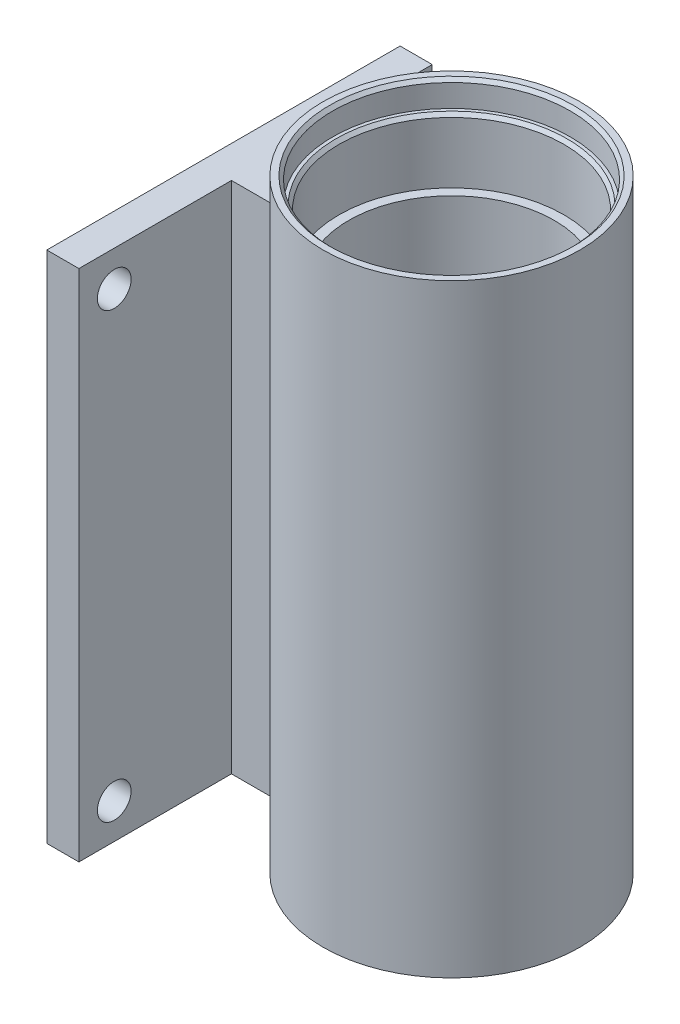
ISO-10303-21;
HEADER;
FILE_DESCRIPTION(('STEP AP214'),'2;1');
FILE_NAME('part.step','',(''),(''),'','','');
FILE_SCHEMA(('AUTOMOTIVE_DESIGN { 1 0 10303 214 1 1 1 1 }'));
ENDSEC;
DATA;
#1=APPLICATION_CONTEXT('core data for automotive mechanical design processes');
#2=APPLICATION_PROTOCOL_DEFINITION('international standard','automotive_design',2000,#1);
#3=PRODUCT_CONTEXT('',#1,'mechanical');
#4=PRODUCT('Part','Part','',(#3));
#5=PRODUCT_RELATED_PRODUCT_CATEGORY('part','',(#4));
#6=PRODUCT_DEFINITION_FORMATION('','',#4);
#7=PRODUCT_DEFINITION_CONTEXT('part definition',#1,'design');
#8=PRODUCT_DEFINITION('design','',#6,#7);
#9=PRODUCT_DEFINITION_SHAPE('','',#8);
#10=(LENGTH_UNIT() NAMED_UNIT(*) SI_UNIT(.MILLI.,.METRE.));
#11=(NAMED_UNIT(*) PLANE_ANGLE_UNIT() SI_UNIT($,.RADIAN.));
#12=(NAMED_UNIT(*) SI_UNIT($,.STERADIAN.) SOLID_ANGLE_UNIT());
#13=UNCERTAINTY_MEASURE_WITH_UNIT(LENGTH_MEASURE(1.E-05),#10,'distance_accuracy_value','');
#14=(GEOMETRIC_REPRESENTATION_CONTEXT(3) GLOBAL_UNCERTAINTY_ASSIGNED_CONTEXT((#13)) GLOBAL_UNIT_ASSIGNED_CONTEXT((#10,
#11,#12)) REPRESENTATION_CONTEXT('',''));
#15=CARTESIAN_POINT('',(0.,0.,0.));
#16=DIRECTION('',(0.,0.,1.));
#17=DIRECTION('',(1.,0.,0.));
#18=AXIS2_PLACEMENT_3D('',#15,#16,#17);
#19=CARTESIAN_POINT('',(0.,160.,0.));
#20=DIRECTION('',(0.,-1.,0.));
#21=DIRECTION('',(0.,0.,-1.));
#22=AXIS2_PLACEMENT_3D('',#19,#20,#21);
#23=CYLINDRICAL_SURFACE('',#22,32.);
#24=CARTESIAN_POINT('',(0.,160.,0.));
#25=DIRECTION('',(0.,1.,0.));
#26=DIRECTION('',(0.,0.,1.));
#27=AXIS2_PLACEMENT_3D('',#24,#25,#26);
#28=CIRCLE('',#27,32.);
#29=CARTESIAN_POINT('',(0.,160.,32.));
#30=VERTEX_POINT('',#29);
#31=EDGE_CURVE('E154',#30,#30,#28,.T.);
#32=ORIENTED_EDGE('',*,*,#31,.T.);
#33=EDGE_LOOP('',(#32));
#34=FACE_BOUND('',#33,.T.);
#35=CARTESIAN_POINT('',(0.,20.,0.));
#36=DIRECTION('',(0.,-1.,0.));
#37=DIRECTION('',(0.,0.,-1.));
#38=AXIS2_PLACEMENT_3D('',#35,#36,#37);
#39=CIRCLE('',#38,32.);
#40=CARTESIAN_POINT('',(0.,20.,-32.));
#41=VERTEX_POINT('',#40);
#42=EDGE_CURVE('E228',#41,#41,#39,.T.);
#43=ORIENTED_EDGE('',*,*,#42,.T.);
#44=EDGE_LOOP('',(#43));
#45=FACE_BOUND('',#44,.T.);
#46=ADVANCED_FACE('F45',(#34,#45),#23,.F.);
#47=CARTESIAN_POINT('',(0.,160.,0.));
#48=DIRECTION('',(0.,1.,0.));
#49=DIRECTION('',(0.,0.,1.));
#50=AXIS2_PLACEMENT_3D('',#47,#48,#49);
#51=PLANE('',#50);
#52=ORIENTED_EDGE('',*,*,#31,.F.);
#53=EDGE_LOOP('',(#52));
#54=FACE_BOUND('',#53,.T.);
#55=CARTESIAN_POINT('',(0.,160.,0.));
#56=DIRECTION('',(0.,1.,0.));
#57=DIRECTION('',(0.,0.,1.));
#58=AXIS2_PLACEMENT_3D('',#55,#56,#57);
#59=CIRCLE('',#58,35.);
#60=CARTESIAN_POINT('',(0.,160.,35.));
#61=VERTEX_POINT('',#60);
#62=EDGE_CURVE('E198',#61,#61,#59,.T.);
#63=ORIENTED_EDGE('',*,*,#62,.T.);
#64=EDGE_LOOP('',(#63));
#65=FACE_BOUND('',#64,.T.);
#66=ADVANCED_FACE('F266',(#54,#65),#51,.T.);
#67=CARTESIAN_POINT('',(0.,160.,0.));
#68=DIRECTION('',(0.,1.,0.));
#69=DIRECTION('',(0.,0.,1.));
#70=AXIS2_PLACEMENT_3D('',#67,#68,#69);
#71=CIRCLE('',#70,40.);
#72=CARTESIAN_POINT('',(-39.2905841137543,160.,-7.5));
#73=VERTEX_POINT('',#72);
#74=CARTESIAN_POINT('',(-39.2905841137543,160.,7.5));
#75=VERTEX_POINT('',#74);
#76=EDGE_CURVE('E193',#73,#75,#71,.T.);
#77=ORIENTED_EDGE('',*,*,#76,.F.);
#78=DIRECTION('',(-1.,0.,0.));
#79=VECTOR('',#78,1.);
#80=CARTESIAN_POINT('',(-39.2905841137543,160.,-7.5));
#81=LINE('',#80,#79);
#82=CARTESIAN_POINT('',(-61.,160.,-7.49999999999999));
#83=VERTEX_POINT('',#82);
#84=EDGE_CURVE('E126',#73,#83,#81,.T.);
#85=ORIENTED_EDGE('',*,*,#84,.T.);
#86=DIRECTION('',(0.,0.,-1.));
#87=VECTOR('',#86,1.);
#88=CARTESIAN_POINT('',(-61.,160.,-55.));
#89=LINE('',#88,#87);
#90=CARTESIAN_POINT('',(-61.,160.,-55.));
#91=VERTEX_POINT('',#90);
#92=EDGE_CURVE('E119',#83,#91,#89,.T.);
#93=ORIENTED_EDGE('',*,*,#92,.T.);
#94=DIRECTION('',(-1.,0.,0.));
#95=VECTOR('',#94,1.);
#96=CARTESIAN_POINT('',(-71.,160.,-55.));
#97=LINE('',#96,#95);
#98=CARTESIAN_POINT('',(-71.,160.,-55.));
#99=VERTEX_POINT('',#98);
#100=EDGE_CURVE('E124',#91,#99,#97,.T.);
#101=ORIENTED_EDGE('',*,*,#100,.T.);
#102=DIRECTION('',(0.,0.,1.));
#103=VECTOR('',#102,1.);
#104=CARTESIAN_POINT('',(-71.,160.,-55.));
#105=LINE('',#104,#103);
#106=CARTESIAN_POINT('',(-71.,160.,55.));
#107=VERTEX_POINT('',#106);
#108=EDGE_CURVE('E63',#99,#107,#105,.T.);
#109=ORIENTED_EDGE('',*,*,#108,.T.);
#110=DIRECTION('',(1.,0.,0.));
#111=VECTOR('',#110,1.);
#112=CARTESIAN_POINT('',(-71.,160.,55.));
#113=LINE('',#112,#111);
#114=CARTESIAN_POINT('',(-61.,160.,55.));
#115=VERTEX_POINT('',#114);
#116=EDGE_CURVE('E172',#107,#115,#113,.T.);
#117=ORIENTED_EDGE('',*,*,#116,.T.);
#118=DIRECTION('',(0.,0.,-1.));
#119=VECTOR('',#118,1.);
#120=CARTESIAN_POINT('',(-61.,160.,55.));
#121=LINE('',#120,#119);
#122=CARTESIAN_POINT('',(-61.,160.,7.50000000000001));
#123=VERTEX_POINT('',#122);
#124=EDGE_CURVE('E108',#115,#123,#121,.T.);
#125=ORIENTED_EDGE('',*,*,#124,.T.);
#126=DIRECTION('',(1.,0.,0.));
#127=VECTOR('',#126,1.);
#128=CARTESIAN_POINT('',(-39.2905841137543,160.,7.5));
#129=LINE('',#128,#127);
#130=EDGE_CURVE('E205',#123,#75,#129,.T.);
#131=ORIENTED_EDGE('',*,*,#130,.T.);
#132=EDGE_LOOP('',(#77,#85,#93,#101,#109,#117,#125,#131));
#133=FACE_BOUND('',#132,.T.);
#134=ADVANCED_FACE('F122',(#133),#51,.T.);
#135=CARTESIAN_POINT('',(0.,0.,0.));
#136=DIRECTION('',(0.,1.,0.));
#137=DIRECTION('',(0.,0.,1.));
#138=AXIS2_PLACEMENT_3D('',#135,#136,#137);
#139=PLANE('',#138);
#140=CARTESIAN_POINT('',(0.,0.,0.));
#141=DIRECTION('',(0.,1.,0.));
#142=DIRECTION('',(0.,0.,1.));
#143=AXIS2_PLACEMENT_3D('',#140,#141,#142);
#144=CIRCLE('',#143,36.);
#145=CARTESIAN_POINT('',(0.,0.,36.));
#146=VERTEX_POINT('',#145);
#147=EDGE_CURVE('E11',#146,#146,#144,.T.);
#148=ORIENTED_EDGE('',*,*,#147,.T.);
#149=EDGE_LOOP('',(#148));
#150=FACE_BOUND('',#149,.T.);
#151=DIRECTION('',(1.,0.,0.));
#152=VECTOR('',#151,1.);
#153=CARTESIAN_POINT('',(-71.,0.,55.));
#154=LINE('',#153,#152);
#155=CARTESIAN_POINT('',(-71.,0.,55.));
#156=VERTEX_POINT('',#155);
#157=CARTESIAN_POINT('',(-61.,0.,55.));
#158=VERTEX_POINT('',#157);
#159=EDGE_CURVE('E149',#156,#158,#154,.T.);
#160=ORIENTED_EDGE('',*,*,#159,.F.);
#161=DIRECTION('',(0.,0.,1.));
#162=VECTOR('',#161,1.);
#163=CARTESIAN_POINT('',(-71.,0.,-55.));
#164=LINE('',#163,#162);
#165=CARTESIAN_POINT('',(-71.,0.,-55.));
#166=VERTEX_POINT('',#165);
#167=EDGE_CURVE('E99',#166,#156,#164,.T.);
#168=ORIENTED_EDGE('',*,*,#167,.F.);
#169=DIRECTION('',(-1.,0.,0.));
#170=VECTOR('',#169,1.);
#171=CARTESIAN_POINT('',(-71.,0.,-55.));
#172=LINE('',#171,#170);
#173=CARTESIAN_POINT('',(-61.,0.,-55.));
#174=VERTEX_POINT('',#173);
#175=EDGE_CURVE('E93',#174,#166,#172,.T.);
#176=ORIENTED_EDGE('',*,*,#175,.F.);
#177=DIRECTION('',(0.,0.,-1.));
#178=VECTOR('',#177,1.);
#179=CARTESIAN_POINT('',(-61.,0.,-55.));
#180=LINE('',#179,#178);
#181=CARTESIAN_POINT('',(-61.,0.,-7.49999999999999));
#182=VERTEX_POINT('',#181);
#183=EDGE_CURVE('E135',#182,#174,#180,.T.);
#184=ORIENTED_EDGE('',*,*,#183,.F.);
#185=DIRECTION('',(-1.,0.,0.));
#186=VECTOR('',#185,1.);
#187=CARTESIAN_POINT('',(-39.2905841137543,0.,-7.5));
#188=LINE('',#187,#186);
#189=CARTESIAN_POINT('',(-39.2905841137543,0.,-7.5));
#190=VERTEX_POINT('',#189);
#191=EDGE_CURVE('E163',#190,#182,#188,.T.);
#192=ORIENTED_EDGE('',*,*,#191,.F.);
#193=CARTESIAN_POINT('',(0.,0.,0.));
#194=DIRECTION('',(0.,1.,0.));
#195=DIRECTION('',(0.,0.,1.));
#196=AXIS2_PLACEMENT_3D('',#193,#194,#195);
#197=CIRCLE('',#196,40.);
#198=CARTESIAN_POINT('',(-39.2905841137543,0.,7.5));
#199=VERTEX_POINT('',#198);
#200=EDGE_CURVE('E160',#199,#190,#197,.T.);
#201=ORIENTED_EDGE('',*,*,#200,.F.);
#202=DIRECTION('',(1.,0.,0.));
#203=VECTOR('',#202,1.);
#204=CARTESIAN_POINT('',(-39.2905841137543,0.,7.5));
#205=LINE('',#204,#203);
#206=CARTESIAN_POINT('',(-61.,0.,7.50000000000001));
#207=VERTEX_POINT('',#206);
#208=EDGE_CURVE('E157',#207,#199,#205,.T.);
#209=ORIENTED_EDGE('',*,*,#208,.F.);
#210=DIRECTION('',(0.,0.,-1.));
#211=VECTOR('',#210,1.);
#212=CARTESIAN_POINT('',(-61.,0.,55.));
#213=LINE('',#212,#211);
#214=EDGE_CURVE('E153',#158,#207,#213,.T.);
#215=ORIENTED_EDGE('',*,*,#214,.F.);
#216=EDGE_LOOP('',(#160,#168,#176,#184,#192,#201,#209,#215));
#217=FACE_BOUND('',#216,.T.);
#218=ADVANCED_FACE('F280',(#150,#217),#139,.F.);
#219=CARTESIAN_POINT('',(-71.,160.,55.));
#220=DIRECTION('',(0.,0.,-1.));
#221=DIRECTION('',(-1.,0.,0.));
#222=AXIS2_PLACEMENT_3D('',#219,#220,#221);
#223=PLANE('',#222);
#224=ORIENTED_EDGE('',*,*,#159,.T.);
#225=DIRECTION('',(0.,-1.,0.));
#226=VECTOR('',#225,1.);
#227=CARTESIAN_POINT('',(-61.,160.,55.));
#228=LINE('',#227,#226);
#229=EDGE_CURVE('E184',#115,#158,#228,.T.);
#230=ORIENTED_EDGE('',*,*,#229,.F.);
#231=ORIENTED_EDGE('',*,*,#116,.F.);
#232=DIRECTION('',(0.,-1.,0.));
#233=VECTOR('',#232,1.);
#234=CARTESIAN_POINT('',(-71.,160.,55.));
#235=LINE('',#234,#233);
#236=EDGE_CURVE('E145',#107,#156,#235,.T.);
#237=ORIENTED_EDGE('',*,*,#236,.T.);
#238=EDGE_LOOP('',(#224,#230,#231,#237));
#239=FACE_BOUND('',#238,.T.);
#240=ADVANCED_FACE('F283',(#239),#223,.F.);
#241=CARTESIAN_POINT('',(-61.,160.,55.));
#242=DIRECTION('',(-1.,0.,0.));
#243=DIRECTION('',(0.,0.,1.));
#244=AXIS2_PLACEMENT_3D('',#241,#242,#243);
#245=PLANE('',#244);
#246=CARTESIAN_POINT('',(-61.,10.9999999999997,44.0000000000001));
#247=DIRECTION('',(-1.,0.,0.));
#248=DIRECTION('',(0.,0.,1.));
#249=AXIS2_PLACEMENT_3D('',#246,#247,#248);
#250=CIRCLE('',#249,5.25);
#251=CARTESIAN_POINT('',(-61.,10.9999999999997,49.2500000000001));
#252=VERTEX_POINT('',#251);
#253=EDGE_CURVE('E353',#252,#252,#250,.T.);
#254=ORIENTED_EDGE('',*,*,#253,.T.);
#255=EDGE_LOOP('',(#254));
#256=FACE_BOUND('',#255,.T.);
#257=CARTESIAN_POINT('',(-61.,149.,44.0000000000001));
#258=DIRECTION('',(-1.,0.,0.));
#259=DIRECTION('',(0.,0.,1.));
#260=AXIS2_PLACEMENT_3D('',#257,#258,#259);
#261=CIRCLE('',#260,5.25);
#262=CARTESIAN_POINT('',(-61.,149.,49.2500000000001));
#263=VERTEX_POINT('',#262);
#264=EDGE_CURVE('E343',#263,#263,#261,.T.);
#265=ORIENTED_EDGE('',*,*,#264,.T.);
#266=EDGE_LOOP('',(#265));
#267=FACE_BOUND('',#266,.T.);
#268=ORIENTED_EDGE('',*,*,#214,.T.);
#269=DIRECTION('',(0.,-1.,0.));
#270=VECTOR('',#269,1.);
#271=CARTESIAN_POINT('',(-61.,160.,7.50000000000001));
#272=LINE('',#271,#270);
#273=EDGE_CURVE('E180',#123,#207,#272,.T.);
#274=ORIENTED_EDGE('',*,*,#273,.F.);
#275=ORIENTED_EDGE('',*,*,#124,.F.);
#276=ORIENTED_EDGE('',*,*,#229,.T.);
#277=EDGE_LOOP('',(#268,#274,#275,#276));
#278=FACE_BOUND('',#277,.T.);
#279=ADVANCED_FACE('F305',(#256,#267,#278),#245,.F.);
#280=CARTESIAN_POINT('',(-39.2905841137543,160.,7.5));
#281=DIRECTION('',(0.,0.,-1.));
#282=DIRECTION('',(-1.,0.,0.));
#283=AXIS2_PLACEMENT_3D('',#280,#281,#282);
#284=PLANE('',#283);
#285=ORIENTED_EDGE('',*,*,#208,.T.);
#286=DIRECTION('',(0.,-1.,0.));
#287=VECTOR('',#286,1.);
#288=CARTESIAN_POINT('',(-39.2905841137543,160.,7.5));
#289=LINE('',#288,#287);
#290=EDGE_CURVE('E185',#75,#199,#289,.T.);
#291=ORIENTED_EDGE('',*,*,#290,.F.);
#292=ORIENTED_EDGE('',*,*,#130,.F.);
#293=ORIENTED_EDGE('',*,*,#273,.T.);
#294=EDGE_LOOP('',(#285,#291,#292,#293));
#295=FACE_BOUND('',#294,.T.);
#296=ADVANCED_FACE('F301',(#295),#284,.F.);
#297=CARTESIAN_POINT('',(0.,160.,0.));
#298=DIRECTION('',(0.,-1.,0.));
#299=DIRECTION('',(0.,0.,-1.));
#300=AXIS2_PLACEMENT_3D('',#297,#298,#299);
#301=CYLINDRICAL_SURFACE('',#300,40.);
#302=ORIENTED_EDGE('',*,*,#200,.T.);
#303=DIRECTION('',(0.,-1.,0.));
#304=VECTOR('',#303,1.);
#305=CARTESIAN_POINT('',(-39.2905841137543,160.,-7.5));
#306=LINE('',#305,#304);
#307=EDGE_CURVE('E179',#73,#190,#306,.T.);
#308=ORIENTED_EDGE('',*,*,#307,.F.);
#309=ORIENTED_EDGE('',*,*,#76,.T.);
#310=ORIENTED_EDGE('',*,*,#290,.T.);
#311=EDGE_LOOP('',(#302,#308,#309,#310));
#312=FACE_BOUND('',#311,.T.);
#313=CARTESIAN_POINT('',(0.,188.,0.));
#314=DIRECTION('',(0.,1.,0.));
#315=DIRECTION('',(0.,0.,1.));
#316=AXIS2_PLACEMENT_3D('',#313,#314,#315);
#317=CIRCLE('',#316,40.);
#318=CARTESIAN_POINT('',(0.,188.,40.));
#319=VERTEX_POINT('',#318);
#320=EDGE_CURVE('E232',#319,#319,#317,.T.);
#321=ORIENTED_EDGE('',*,*,#320,.F.);
#322=EDGE_LOOP('',(#321));
#323=FACE_BOUND('',#322,.T.);
#324=ADVANCED_FACE('F297',(#312,#323),#301,.T.);
#325=CARTESIAN_POINT('',(-39.2905841137543,160.,-7.5));
#326=DIRECTION('',(0.,0.,1.));
#327=DIRECTION('',(1.,0.,0.));
#328=AXIS2_PLACEMENT_3D('',#325,#326,#327);
#329=PLANE('',#328);
#330=ORIENTED_EDGE('',*,*,#191,.T.);
#331=DIRECTION('',(0.,-1.,0.));
#332=VECTOR('',#331,1.);
#333=CARTESIAN_POINT('',(-61.,160.,-7.49999999999999));
#334=LINE('',#333,#332);
#335=EDGE_CURVE('E137',#83,#182,#334,.T.);
#336=ORIENTED_EDGE('',*,*,#335,.F.);
#337=ORIENTED_EDGE('',*,*,#84,.F.);
#338=ORIENTED_EDGE('',*,*,#307,.T.);
#339=EDGE_LOOP('',(#330,#336,#337,#338));
#340=FACE_BOUND('',#339,.T.);
#341=ADVANCED_FACE('F293',(#340),#329,.F.);
#342=CARTESIAN_POINT('',(-61.,160.,-55.));
#343=DIRECTION('',(-1.,0.,0.));
#344=DIRECTION('',(0.,0.,1.));
#345=AXIS2_PLACEMENT_3D('',#342,#343,#344);
#346=PLANE('',#345);
#347=CARTESIAN_POINT('',(-61.,11.,-44.));
#348=DIRECTION('',(-1.,0.,0.));
#349=DIRECTION('',(0.,0.,1.));
#350=AXIS2_PLACEMENT_3D('',#347,#348,#349);
#351=CIRCLE('',#350,5.25);
#352=CARTESIAN_POINT('',(-61.,11.,-38.75));
#353=VERTEX_POINT('',#352);
#354=EDGE_CURVE('E361',#353,#353,#351,.T.);
#355=ORIENTED_EDGE('',*,*,#354,.T.);
#356=EDGE_LOOP('',(#355));
#357=FACE_BOUND('',#356,.T.);
#358=CARTESIAN_POINT('',(-61.,149.,-44.));
#359=DIRECTION('',(-1.,0.,0.));
#360=DIRECTION('',(0.,0.,1.));
#361=AXIS2_PLACEMENT_3D('',#358,#359,#360);
#362=CIRCLE('',#361,5.25);
#363=CARTESIAN_POINT('',(-61.,149.,-38.75));
#364=VERTEX_POINT('',#363);
#365=EDGE_CURVE('E333',#364,#364,#362,.T.);
#366=ORIENTED_EDGE('',*,*,#365,.T.);
#367=EDGE_LOOP('',(#366));
#368=FACE_BOUND('',#367,.T.);
#369=ORIENTED_EDGE('',*,*,#183,.T.);
#370=DIRECTION('',(0.,-1.,0.));
#371=VECTOR('',#370,1.);
#372=CARTESIAN_POINT('',(-61.,160.,-55.));
#373=LINE('',#372,#371);
#374=EDGE_CURVE('E132',#91,#174,#373,.T.);
#375=ORIENTED_EDGE('',*,*,#374,.F.);
#376=ORIENTED_EDGE('',*,*,#92,.F.);
#377=ORIENTED_EDGE('',*,*,#335,.T.);
#378=EDGE_LOOP('',(#369,#375,#376,#377));
#379=FACE_BOUND('',#378,.T.);
#380=ADVANCED_FACE('F133',(#357,#368,#379),#346,.F.);
#381=CARTESIAN_POINT('',(-71.,160.,-55.));
#382=DIRECTION('',(0.,0.,1.));
#383=DIRECTION('',(1.,0.,0.));
#384=AXIS2_PLACEMENT_3D('',#381,#382,#383);
#385=PLANE('',#384);
#386=ORIENTED_EDGE('',*,*,#175,.T.);
#387=DIRECTION('',(0.,-1.,0.));
#388=VECTOR('',#387,1.);
#389=CARTESIAN_POINT('',(-71.,160.,-55.));
#390=LINE('',#389,#388);
#391=EDGE_CURVE('E138',#99,#166,#390,.T.);
#392=ORIENTED_EDGE('',*,*,#391,.F.);
#393=ORIENTED_EDGE('',*,*,#100,.F.);
#394=ORIENTED_EDGE('',*,*,#374,.T.);
#395=EDGE_LOOP('',(#386,#392,#393,#394));
#396=FACE_BOUND('',#395,.T.);
#397=ADVANCED_FACE('F140',(#396),#385,.F.);
#398=CARTESIAN_POINT('',(-71.,160.,-55.));
#399=DIRECTION('',(1.,0.,0.));
#400=DIRECTION('',(0.,0.,-1.));
#401=AXIS2_PLACEMENT_3D('',#398,#399,#400);
#402=PLANE('',#401);
#403=CARTESIAN_POINT('',(-71.,11.,0.));
#404=DIRECTION('',(-1.,0.,0.));
#405=DIRECTION('',(0.,0.,-1.));
#406=AXIS2_PLACEMENT_3D('',#403,#404,#405);
#407=CIRCLE('',#406,4.);
#408=CARTESIAN_POINT('',(-71.,11.,-3.99999999999999));
#409=VERTEX_POINT('',#408);
#410=EDGE_CURVE('E378',#409,#409,#407,.T.);
#411=ORIENTED_EDGE('',*,*,#410,.F.);
#412=EDGE_LOOP('',(#411));
#413=FACE_BOUND('',#412,.T.);
#414=CARTESIAN_POINT('',(-71.,149.,0.));
#415=DIRECTION('',(-1.,0.,0.));
#416=DIRECTION('',(0.,0.,1.));
#417=AXIS2_PLACEMENT_3D('',#414,#415,#416);
#418=CIRCLE('',#417,4.);
#419=CARTESIAN_POINT('',(-71.,149.,4.00000000000001));
#420=VERTEX_POINT('',#419);
#421=EDGE_CURVE('E370',#420,#420,#418,.T.);
#422=ORIENTED_EDGE('',*,*,#421,.F.);
#423=EDGE_LOOP('',(#422));
#424=FACE_BOUND('',#423,.T.);
#425=CARTESIAN_POINT('',(-71.,11.,-44.));
#426=DIRECTION('',(-1.,0.,0.));
#427=DIRECTION('',(0.,0.,-1.));
#428=AXIS2_PLACEMENT_3D('',#425,#426,#427);
#429=CIRCLE('',#428,5.25);
#430=CARTESIAN_POINT('',(-71.,11.,-49.25));
#431=VERTEX_POINT('',#430);
#432=EDGE_CURVE('E365',#431,#431,#429,.T.);
#433=ORIENTED_EDGE('',*,*,#432,.F.);
#434=EDGE_LOOP('',(#433));
#435=FACE_BOUND('',#434,.T.);
#436=CARTESIAN_POINT('',(-71.,10.9999999999997,44.0000000000001));
#437=DIRECTION('',(-1.,0.,0.));
#438=DIRECTION('',(0.,0.,1.));
#439=AXIS2_PLACEMENT_3D('',#436,#437,#438);
#440=CIRCLE('',#439,5.25);
#441=CARTESIAN_POINT('',(-71.,10.9999999999997,49.2500000000001));
#442=VERTEX_POINT('',#441);
#443=EDGE_CURVE('E357',#442,#442,#440,.T.);
#444=ORIENTED_EDGE('',*,*,#443,.F.);
#445=EDGE_LOOP('',(#444));
#446=FACE_BOUND('',#445,.T.);
#447=CARTESIAN_POINT('',(-71.,149.,44.0000000000001));
#448=DIRECTION('',(-1.,0.,0.));
#449=DIRECTION('',(0.,0.,-1.));
#450=AXIS2_PLACEMENT_3D('',#447,#448,#449);
#451=CIRCLE('',#450,5.25);
#452=CARTESIAN_POINT('',(-71.,149.,38.7500000000001));
#453=VERTEX_POINT('',#452);
#454=EDGE_CURVE('E349',#453,#453,#451,.T.);
#455=ORIENTED_EDGE('',*,*,#454,.F.);
#456=EDGE_LOOP('',(#455));
#457=FACE_BOUND('',#456,.T.);
#458=CARTESIAN_POINT('',(-71.,149.,-44.));
#459=DIRECTION('',(-1.,0.,0.));
#460=DIRECTION('',(0.,0.,1.));
#461=AXIS2_PLACEMENT_3D('',#458,#459,#460);
#462=CIRCLE('',#461,5.25);
#463=CARTESIAN_POINT('',(-71.,149.,-38.75));
#464=VERTEX_POINT('',#463);
#465=EDGE_CURVE('E337',#464,#464,#462,.T.);
#466=ORIENTED_EDGE('',*,*,#465,.F.);
#467=EDGE_LOOP('',(#466));
#468=FACE_BOUND('',#467,.T.);
#469=ORIENTED_EDGE('',*,*,#167,.T.);
#470=ORIENTED_EDGE('',*,*,#236,.F.);
#471=ORIENTED_EDGE('',*,*,#108,.F.);
#472=ORIENTED_EDGE('',*,*,#391,.T.);
#473=EDGE_LOOP('',(#469,#470,#471,#472));
#474=FACE_BOUND('',#473,.T.);
#475=ADVANCED_FACE('F285',(#413,#424,#435,#446,#457,#468,#474),#402,.F.);
#476=CARTESIAN_POINT('',(0.,180.,0.));
#477=DIRECTION('',(0.,1.,0.));
#478=DIRECTION('',(0.,0.,1.));
#479=AXIS2_PLACEMENT_3D('',#476,#477,#478);
#480=PLANE('',#479);
#481=CARTESIAN_POINT('',(0.,180.,0.));
#482=DIRECTION('',(0.,1.,0.));
#483=DIRECTION('',(0.,0.,1.));
#484=AXIS2_PLACEMENT_3D('',#481,#482,#483);
#485=CIRCLE('',#484,36.);
#486=CARTESIAN_POINT('',(0.,180.,36.));
#487=VERTEX_POINT('',#486);
#488=EDGE_CURVE('E237',#487,#487,#485,.F.);
#489=ORIENTED_EDGE('',*,*,#488,.T.);
#490=EDGE_LOOP('',(#489));
#491=FACE_BOUND('',#490,.T.);
#492=CARTESIAN_POINT('',(0.,180.,0.));
#493=DIRECTION('',(0.,1.,0.));
#494=DIRECTION('',(0.,0.,1.));
#495=AXIS2_PLACEMENT_3D('',#492,#493,#494);
#496=CIRCLE('',#495,37.);
#497=CARTESIAN_POINT('',(0.,180.,37.));
#498=VERTEX_POINT('',#497);
#499=EDGE_CURVE('E188',#498,#498,#496,.F.);
#500=ORIENTED_EDGE('',*,*,#499,.F.);
#501=EDGE_LOOP('',(#500));
#502=FACE_BOUND('',#501,.T.);
#503=ADVANCED_FACE('F276',(#491,#502),#480,.T.);
#504=CARTESIAN_POINT('',(0.,180.,0.));
#505=DIRECTION('',(0.,-1.,0.));
#506=DIRECTION('',(0.,0.,-1.));
#507=AXIS2_PLACEMENT_3D('',#504,#505,#506);
#508=CYLINDRICAL_SURFACE('',#507,35.);
#509=CARTESIAN_POINT('',(0.,179.,0.));
#510=DIRECTION('',(0.,1.,0.));
#511=DIRECTION('',(0.,0.,1.));
#512=AXIS2_PLACEMENT_3D('',#509,#510,#511);
#513=CIRCLE('',#512,35.);
#514=CARTESIAN_POINT('',(0.,179.,35.));
#515=VERTEX_POINT('',#514);
#516=EDGE_CURVE('E227',#515,#515,#513,.T.);
#517=ORIENTED_EDGE('',*,*,#516,.T.);
#518=EDGE_LOOP('',(#517));
#519=FACE_BOUND('',#518,.T.);
#520=ORIENTED_EDGE('',*,*,#62,.F.);
#521=EDGE_LOOP('',(#520));
#522=FACE_BOUND('',#521,.T.);
#523=ADVANCED_FACE('F325',(#519,#522),#508,.F.);
#524=CARTESIAN_POINT('',(-51.,149.,-44.));
#525=DIRECTION('',(-1.,0.,0.));
#526=DIRECTION('',(0.,0.,1.));
#527=AXIS2_PLACEMENT_3D('',#524,#525,#526);
#528=CYLINDRICAL_SURFACE('',#527,5.25);
#529=ORIENTED_EDGE('',*,*,#465,.T.);
#530=EDGE_LOOP('',(#529));
#531=FACE_BOUND('',#530,.T.);
#532=ORIENTED_EDGE('',*,*,#365,.F.);
#533=EDGE_LOOP('',(#532));
#534=FACE_BOUND('',#533,.T.);
#535=ADVANCED_FACE('F328',(#531,#534),#528,.F.);
#536=CARTESIAN_POINT('',(-51.,149.,44.0000000000001));
#537=DIRECTION('',(-1.,0.,0.));
#538=DIRECTION('',(0.,0.,1.));
#539=AXIS2_PLACEMENT_3D('',#536,#537,#538);
#540=CYLINDRICAL_SURFACE('',#539,5.25);
#541=ORIENTED_EDGE('',*,*,#454,.T.);
#542=EDGE_LOOP('',(#541));
#543=FACE_BOUND('',#542,.T.);
#544=ORIENTED_EDGE('',*,*,#264,.F.);
#545=EDGE_LOOP('',(#544));
#546=FACE_BOUND('',#545,.T.);
#547=ADVANCED_FACE('F429',(#543,#546),#540,.F.);
#548=CARTESIAN_POINT('',(-51.,10.9999999999997,44.0000000000001));
#549=DIRECTION('',(-1.,0.,0.));
#550=DIRECTION('',(0.,0.,1.));
#551=AXIS2_PLACEMENT_3D('',#548,#549,#550);
#552=CYLINDRICAL_SURFACE('',#551,5.25);
#553=ORIENTED_EDGE('',*,*,#443,.T.);
#554=EDGE_LOOP('',(#553));
#555=FACE_BOUND('',#554,.T.);
#556=ORIENTED_EDGE('',*,*,#253,.F.);
#557=EDGE_LOOP('',(#556));
#558=FACE_BOUND('',#557,.T.);
#559=ADVANCED_FACE('F425',(#555,#558),#552,.F.);
#560=CARTESIAN_POINT('',(-51.,11.,-44.));
#561=DIRECTION('',(-1.,0.,0.));
#562=DIRECTION('',(0.,0.,1.));
#563=AXIS2_PLACEMENT_3D('',#560,#561,#562);
#564=CYLINDRICAL_SURFACE('',#563,5.25);
#565=ORIENTED_EDGE('',*,*,#432,.T.);
#566=EDGE_LOOP('',(#565));
#567=FACE_BOUND('',#566,.T.);
#568=ORIENTED_EDGE('',*,*,#354,.F.);
#569=EDGE_LOOP('',(#568));
#570=FACE_BOUND('',#569,.T.);
#571=ADVANCED_FACE('F421',(#567,#570),#564,.F.);
#572=CARTESIAN_POINT('',(-59.,149.,0.));
#573=DIRECTION('',(-1.,0.,0.));
#574=DIRECTION('',(0.,0.,1.));
#575=AXIS2_PLACEMENT_3D('',#572,#573,#574);
#576=CYLINDRICAL_SURFACE('',#575,4.);
#577=CARTESIAN_POINT('',(-59.,149.,0.));
#578=DIRECTION('',(-1.,0.,0.));
#579=DIRECTION('',(0.,0.,1.));
#580=AXIS2_PLACEMENT_3D('',#577,#578,#579);
#581=CIRCLE('',#580,4.);
#582=CARTESIAN_POINT('',(-59.,149.,4.00000000000001));
#583=VERTEX_POINT('',#582);
#584=EDGE_CURVE('E369',#583,#583,#581,.T.);
#585=ORIENTED_EDGE('',*,*,#584,.F.);
#586=EDGE_LOOP('',(#585));
#587=FACE_BOUND('',#586,.T.);
#588=ORIENTED_EDGE('',*,*,#421,.T.);
#589=EDGE_LOOP('',(#588));
#590=FACE_BOUND('',#589,.T.);
#591=ADVANCED_FACE('F417',(#587,#590),#576,.F.);
#592=CARTESIAN_POINT('',(-59.,149.,0.));
#593=DIRECTION('',(-1.,0.,0.));
#594=DIRECTION('',(0.,0.,1.));
#595=AXIS2_PLACEMENT_3D('',#592,#593,#594);
#596=PLANE('',#595);
#597=ORIENTED_EDGE('',*,*,#584,.T.);
#598=EDGE_LOOP('',(#597));
#599=FACE_BOUND('',#598,.T.);
#600=ADVANCED_FACE('F413',(#599),#596,.T.);
#601=CARTESIAN_POINT('',(-59.,11.,0.));
#602=DIRECTION('',(-1.,0.,0.));
#603=DIRECTION('',(0.,0.,1.));
#604=AXIS2_PLACEMENT_3D('',#601,#602,#603);
#605=CYLINDRICAL_SURFACE('',#604,4.);
#606=CARTESIAN_POINT('',(-59.,11.,0.));
#607=DIRECTION('',(-1.,0.,0.));
#608=DIRECTION('',(0.,0.,-1.));
#609=AXIS2_PLACEMENT_3D('',#606,#607,#608);
#610=CIRCLE('',#609,4.);
#611=CARTESIAN_POINT('',(-59.,11.,-3.99999999999999));
#612=VERTEX_POINT('',#611);
#613=EDGE_CURVE('E374',#612,#612,#610,.T.);
#614=ORIENTED_EDGE('',*,*,#613,.F.);
#615=EDGE_LOOP('',(#614));
#616=FACE_BOUND('',#615,.T.);
#617=ORIENTED_EDGE('',*,*,#410,.T.);
#618=EDGE_LOOP('',(#617));
#619=FACE_BOUND('',#618,.T.);
#620=ADVANCED_FACE('F409',(#616,#619),#605,.F.);
#621=CARTESIAN_POINT('',(-59.,11.,0.));
#622=DIRECTION('',(1.,0.,0.));
#623=DIRECTION('',(0.,0.,-1.));
#624=AXIS2_PLACEMENT_3D('',#621,#622,#623);
#625=PLANE('',#624);
#626=ORIENTED_EDGE('',*,*,#613,.T.);
#627=EDGE_LOOP('',(#626));
#628=FACE_BOUND('',#627,.T.);
#629=ADVANCED_FACE('F405',(#628),#625,.F.);
#630=CARTESIAN_POINT('',(0.,188.,0.));
#631=DIRECTION('',(0.,1.,0.));
#632=DIRECTION('',(0.,0.,1.));
#633=AXIS2_PLACEMENT_3D('',#630,#631,#632);
#634=PLANE('',#633);
#635=CARTESIAN_POINT('',(0.,188.,0.));
#636=DIRECTION('',(0.,1.,0.));
#637=DIRECTION('',(0.,0.,1.));
#638=AXIS2_PLACEMENT_3D('',#635,#636,#637);
#639=CIRCLE('',#638,38.0000000000001);
#640=CARTESIAN_POINT('',(0.,188.,38.0000000000001));
#641=VERTEX_POINT('',#640);
#642=EDGE_CURVE('E245',#641,#641,#639,.F.);
#643=ORIENTED_EDGE('',*,*,#642,.T.);
#644=EDGE_LOOP('',(#643));
#645=FACE_BOUND('',#644,.T.);
#646=ORIENTED_EDGE('',*,*,#320,.T.);
#647=EDGE_LOOP('',(#646));
#648=FACE_BOUND('',#647,.T.);
#649=ADVANCED_FACE('F399',(#645,#648),#634,.T.);
#650=CARTESIAN_POINT('',(0.,188.,0.));
#651=DIRECTION('',(0.,-1.,0.));
#652=DIRECTION('',(0.,0.,-1.));
#653=AXIS2_PLACEMENT_3D('',#650,#651,#652);
#654=CYLINDRICAL_SURFACE('',#653,37.);
#655=CARTESIAN_POINT('',(0.,187.,0.));
#656=DIRECTION('',(0.,1.,0.));
#657=DIRECTION('',(0.,0.,1.));
#658=AXIS2_PLACEMENT_3D('',#655,#656,#657);
#659=CIRCLE('',#658,37.);
#660=CARTESIAN_POINT('',(0.,187.,37.));
#661=VERTEX_POINT('',#660);
#662=EDGE_CURVE('E241',#661,#661,#659,.T.);
#663=ORIENTED_EDGE('',*,*,#662,.T.);
#664=EDGE_LOOP('',(#663));
#665=FACE_BOUND('',#664,.T.);
#666=ORIENTED_EDGE('',*,*,#499,.T.);
#667=EDGE_LOOP('',(#666));
#668=FACE_BOUND('',#667,.T.);
#669=ADVANCED_FACE('F394',(#665,#668),#654,.F.);
#670=CARTESIAN_POINT('',(0.,20.,0.));
#671=DIRECTION('',(0.,-1.,0.));
#672=DIRECTION('',(0.,0.,-1.));
#673=AXIS2_PLACEMENT_3D('',#670,#671,#672);
#674=CYLINDRICAL_SURFACE('',#673,35.);
#675=CARTESIAN_POINT('',(0.,0.999999999999994,0.));
#676=DIRECTION('',(0.,1.,0.));
#677=DIRECTION('',(0.,0.,1.));
#678=AXIS2_PLACEMENT_3D('',#675,#676,#677);
#679=CIRCLE('',#678,35.);
#680=CARTESIAN_POINT('',(0.,0.999999999999994,35.));
#681=VERTEX_POINT('',#680);
#682=EDGE_CURVE('E55',#681,#681,#679,.F.);
#683=ORIENTED_EDGE('',*,*,#682,.T.);
#684=EDGE_LOOP('',(#683));
#685=FACE_BOUND('',#684,.T.);
#686=CARTESIAN_POINT('',(0.,20.,0.));
#687=DIRECTION('',(0.,-1.,0.));
#688=DIRECTION('',(0.,0.,-1.));
#689=AXIS2_PLACEMENT_3D('',#686,#687,#688);
#690=CIRCLE('',#689,35.);
#691=CARTESIAN_POINT('',(0.,20.,-35.));
#692=VERTEX_POINT('',#691);
#693=EDGE_CURVE('E233',#692,#692,#690,.T.);
#694=ORIENTED_EDGE('',*,*,#693,.F.);
#695=EDGE_LOOP('',(#694));
#696=FACE_BOUND('',#695,.T.);
#697=ADVANCED_FACE('F253',(#685,#696),#674,.F.);
#698=CARTESIAN_POINT('',(0.,20.,0.));
#699=DIRECTION('',(0.,-1.,0.));
#700=DIRECTION('',(0.,0.,-1.));
#701=AXIS2_PLACEMENT_3D('',#698,#699,#700);
#702=PLANE('',#701);
#703=ORIENTED_EDGE('',*,*,#42,.F.);
#704=EDGE_LOOP('',(#703));
#705=FACE_BOUND('',#704,.T.);
#706=ORIENTED_EDGE('',*,*,#693,.T.);
#707=EDGE_LOOP('',(#706));
#708=FACE_BOUND('',#707,.T.);
#709=ADVANCED_FACE('F314',(#705,#708),#702,.T.);
#710=CARTESIAN_POINT('',(0.,179.,0.));
#711=DIRECTION('',(0.,1.,0.));
#712=DIRECTION('',(0.,0.,1.));
#713=AXIS2_PLACEMENT_3D('',#710,#711,#712);
#714=CONICAL_SURFACE('',#713,35.,0.785398163397445);
#715=ORIENTED_EDGE('',*,*,#488,.F.);
#716=EDGE_LOOP('',(#715));
#717=FACE_BOUND('',#716,.T.);
#718=ORIENTED_EDGE('',*,*,#516,.F.);
#719=EDGE_LOOP('',(#718));
#720=FACE_BOUND('',#719,.T.);
#721=ADVANCED_FACE('F262',(#717,#720),#714,.F.);
#722=CARTESIAN_POINT('',(0.,187.,0.));
#723=DIRECTION('',(0.,1.,0.));
#724=DIRECTION('',(0.,0.,1.));
#725=AXIS2_PLACEMENT_3D('',#722,#723,#724);
#726=CONICAL_SURFACE('',#725,37.,0.785398163397452);
#727=ORIENTED_EDGE('',*,*,#642,.F.);
#728=EDGE_LOOP('',(#727));
#729=FACE_BOUND('',#728,.T.);
#730=ORIENTED_EDGE('',*,*,#662,.F.);
#731=EDGE_LOOP('',(#730));
#732=FACE_BOUND('',#731,.T.);
#733=ADVANCED_FACE('F257',(#729,#732),#726,.F.);
#734=CARTESIAN_POINT('',(0.,0.999999999999994,0.));
#735=DIRECTION('',(0.,-1.,0.));
#736=DIRECTION('',(0.,0.,-1.));
#737=AXIS2_PLACEMENT_3D('',#734,#735,#736);
#738=CONICAL_SURFACE('',#737,35.,0.785398163397448);
#739=ORIENTED_EDGE('',*,*,#147,.F.);
#740=EDGE_LOOP('',(#739));
#741=FACE_BOUND('',#740,.T.);
#742=ORIENTED_EDGE('',*,*,#682,.F.);
#743=EDGE_LOOP('',(#742));
#744=FACE_BOUND('',#743,.T.);
#745=ADVANCED_FACE('F47',(#741,#744),#738,.F.);
#746=CLOSED_SHELL('',(#46,#66,#134,#218,#240,#279,#296,#324,#341,#380,#397,#475,#503,#523,#535,
#547,#559,#571,#591,#600,#620,#629,#649,#669,#697,#709,#721,#733,#745));
#747=MANIFOLD_SOLID_BREP('B2',#746);
#748=ADVANCED_BREP_SHAPE_REPRESENTATION('',(#18,#747),#14);
#749=SHAPE_DEFINITION_REPRESENTATION(#9,#748);
ENDSEC;
END-ISO-10303-21;
